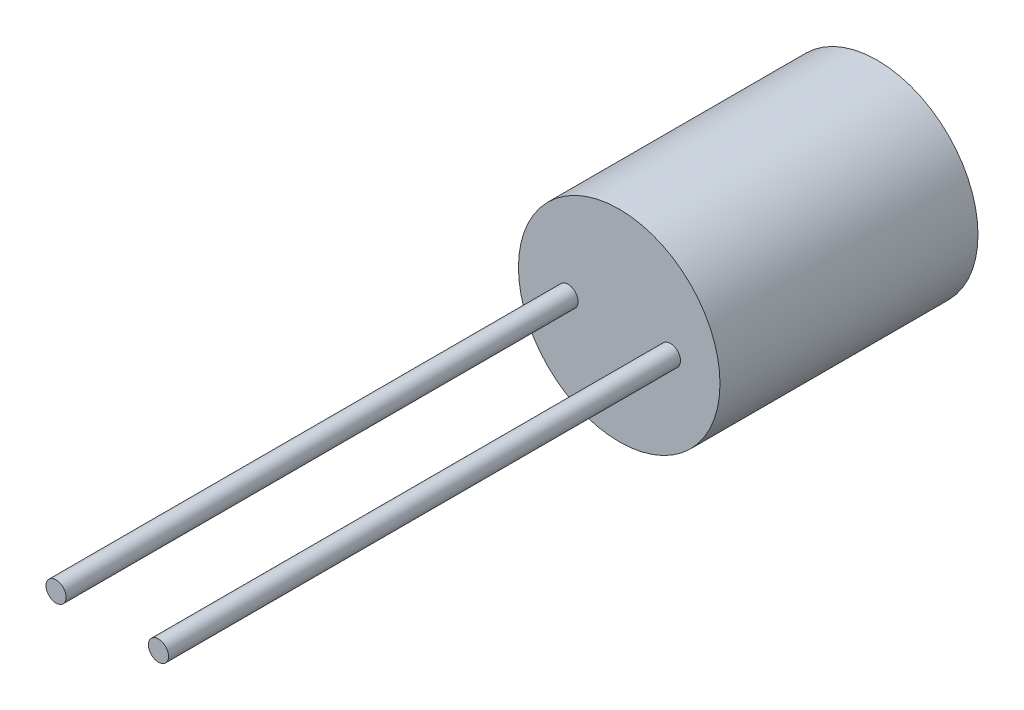
ISO-10303-21;
HEADER;
FILE_DESCRIPTION(('STEP AP214'),'2;1');
FILE_NAME('part.step','',(''),(''),'','','');
FILE_SCHEMA(('AUTOMOTIVE_DESIGN { 1 0 10303 214 1 1 1 1 }'));
ENDSEC;
DATA;
#1=APPLICATION_CONTEXT('core data for automotive mechanical design processes');
#2=APPLICATION_PROTOCOL_DEFINITION('international standard','automotive_design',2000,#1);
#3=PRODUCT_CONTEXT('',#1,'mechanical');
#4=PRODUCT('Part','Part','',(#3));
#5=PRODUCT_RELATED_PRODUCT_CATEGORY('part','',(#4));
#6=PRODUCT_DEFINITION_FORMATION('','',#4);
#7=PRODUCT_DEFINITION_CONTEXT('part definition',#1,'design');
#8=PRODUCT_DEFINITION('design','',#6,#7);
#9=PRODUCT_DEFINITION_SHAPE('','',#8);
#10=(LENGTH_UNIT() NAMED_UNIT(*) SI_UNIT(.MILLI.,.METRE.));
#11=(NAMED_UNIT(*) PLANE_ANGLE_UNIT() SI_UNIT($,.RADIAN.));
#12=(NAMED_UNIT(*) SI_UNIT($,.STERADIAN.) SOLID_ANGLE_UNIT());
#13=UNCERTAINTY_MEASURE_WITH_UNIT(LENGTH_MEASURE(1.E-05),#10,'distance_accuracy_value','');
#14=(GEOMETRIC_REPRESENTATION_CONTEXT(3) GLOBAL_UNCERTAINTY_ASSIGNED_CONTEXT((#13)) GLOBAL_UNIT_ASSIGNED_CONTEXT((#10,
#11,#12)) REPRESENTATION_CONTEXT('',''));
#15=CARTESIAN_POINT('',(0.,0.,0.));
#16=DIRECTION('',(0.,0.,1.));
#17=DIRECTION('',(1.,0.,0.));
#18=AXIS2_PLACEMENT_3D('',#15,#16,#17);
#19=CARTESIAN_POINT('',(0.,0.,6.4));
#20=DIRECTION('',(0.,0.,1.));
#21=DIRECTION('',(1.,0.,0.));
#22=AXIS2_PLACEMENT_3D('',#19,#20,#21);
#23=PLANE('',#22);
#24=CARTESIAN_POINT('',(-1.27,0.,6.4));
#25=DIRECTION('',(0.,0.,1.));
#26=DIRECTION('',(1.,0.,0.));
#27=AXIS2_PLACEMENT_3D('',#24,#25,#26);
#28=CIRCLE('',#27,0.25);
#29=CARTESIAN_POINT('',(-1.02,0.,6.4));
#30=VERTEX_POINT('',#29);
#31=EDGE_CURVE('E48',#30,#30,#28,.T.);
#32=ORIENTED_EDGE('',*,*,#31,.F.);
#33=EDGE_LOOP('',(#32));
#34=FACE_BOUND('',#33,.T.);
#35=CARTESIAN_POINT('',(0.,0.,6.4));
#36=DIRECTION('',(0.,0.,1.));
#37=DIRECTION('',(1.,0.,0.));
#38=AXIS2_PLACEMENT_3D('',#35,#36,#37);
#39=CIRCLE('',#38,2.5);
#40=CARTESIAN_POINT('',(-2.5,0.,6.4));
#41=VERTEX_POINT('',#40);
#42=EDGE_CURVE('E40',#41,#41,#39,.T.);
#43=ORIENTED_EDGE('',*,*,#42,.T.);
#44=EDGE_LOOP('',(#43));
#45=FACE_BOUND('',#44,.T.);
#46=CARTESIAN_POINT('',(1.27,0.,6.4));
#47=DIRECTION('',(0.,0.,1.));
#48=DIRECTION('',(-1.,0.,0.));
#49=AXIS2_PLACEMENT_3D('',#46,#47,#48);
#50=CIRCLE('',#49,0.25);
#51=CARTESIAN_POINT('',(1.02,0.,6.4));
#52=VERTEX_POINT('',#51);
#53=EDGE_CURVE('E54',#52,#52,#50,.T.);
#54=ORIENTED_EDGE('',*,*,#53,.F.);
#55=EDGE_LOOP('',(#54));
#56=FACE_BOUND('',#55,.T.);
#57=ADVANCED_FACE('F33',(#34,#45,#56),#23,.T.);
#58=CARTESIAN_POINT('',(0.,0.,5.4));
#59=DIRECTION('',(0.,0.,-1.));
#60=DIRECTION('',(-1.,0.,0.));
#61=AXIS2_PLACEMENT_3D('',#58,#59,#60);
#62=CYLINDRICAL_SURFACE('',#61,2.5);
#63=CARTESIAN_POINT('',(0.,0.,0.));
#64=DIRECTION('',(0.,0.,1.));
#65=DIRECTION('',(1.,0.,0.));
#66=AXIS2_PLACEMENT_3D('',#63,#64,#65);
#67=CIRCLE('',#66,2.5);
#68=CARTESIAN_POINT('',(-2.5,0.,0.));
#69=VERTEX_POINT('',#68);
#70=EDGE_CURVE('E10',#69,#69,#67,.T.);
#71=CARTESIAN_POINT('',(-2.5,0.,0.));
#72=CARTESIAN_POINT('',(-2.5,0.,0.0666666666666657));
#73=CARTESIAN_POINT('',(-2.5,0.,0.133333333333332));
#74=CARTESIAN_POINT('',(-2.5,0.,0.266666666666666));
#75=CARTESIAN_POINT('',(-2.5,0.,0.333333333333332));
#76=CARTESIAN_POINT('',(-2.5,0.,0.466666666666666));
#77=CARTESIAN_POINT('',(-2.5,0.,0.533333333333332));
#78=CARTESIAN_POINT('',(-2.5,0.,0.666666666666666));
#79=CARTESIAN_POINT('',(-2.5,0.,0.733333333333333));
#80=CARTESIAN_POINT('',(-2.5,0.,0.866666666666666));
#81=CARTESIAN_POINT('',(-2.5,0.,0.933333333333333));
#82=CARTESIAN_POINT('',(-2.5,0.,1.06666666666667));
#83=CARTESIAN_POINT('',(-2.5,0.,1.13333333333333));
#84=CARTESIAN_POINT('',(-2.5,0.,1.26666666666667));
#85=CARTESIAN_POINT('',(-2.5,0.,1.33333333333333));
#86=CARTESIAN_POINT('',(-2.5,0.,1.46666666666667));
#87=CARTESIAN_POINT('',(-2.5,0.,1.53333333333333));
#88=CARTESIAN_POINT('',(-2.5,0.,1.66666666666667));
#89=CARTESIAN_POINT('',(-2.5,0.,1.73333333333333));
#90=CARTESIAN_POINT('',(-2.5,0.,1.86666666666667));
#91=CARTESIAN_POINT('',(-2.5,0.,1.93333333333333));
#92=CARTESIAN_POINT('',(-2.5,0.,2.06666666666667));
#93=CARTESIAN_POINT('',(-2.5,0.,2.13333333333333));
#94=CARTESIAN_POINT('',(-2.5,0.,2.26666666666667));
#95=CARTESIAN_POINT('',(-2.5,0.,2.33333333333333));
#96=CARTESIAN_POINT('',(-2.5,0.,2.46666666666667));
#97=CARTESIAN_POINT('',(-2.5,0.,2.53333333333333));
#98=CARTESIAN_POINT('',(-2.5,0.,2.66666666666667));
#99=CARTESIAN_POINT('',(-2.5,0.,2.73333333333333));
#100=CARTESIAN_POINT('',(-2.5,0.,2.86666666666667));
#101=CARTESIAN_POINT('',(-2.5,0.,2.93333333333333));
#102=CARTESIAN_POINT('',(-2.5,0.,3.06666666666667));
#103=CARTESIAN_POINT('',(-2.5,0.,3.13333333333333));
#104=CARTESIAN_POINT('',(-2.5,0.,3.26666666666667));
#105=CARTESIAN_POINT('',(-2.5,0.,3.33333333333333));
#106=CARTESIAN_POINT('',(-2.5,0.,3.46666666666667));
#107=CARTESIAN_POINT('',(-2.5,0.,3.53333333333333));
#108=CARTESIAN_POINT('',(-2.5,0.,3.66666666666667));
#109=CARTESIAN_POINT('',(-2.5,0.,3.73333333333333));
#110=CARTESIAN_POINT('',(-2.5,0.,3.86666666666667));
#111=CARTESIAN_POINT('',(-2.5,0.,3.93333333333333));
#112=CARTESIAN_POINT('',(-2.5,0.,4.06666666666667));
#113=CARTESIAN_POINT('',(-2.5,0.,4.13333333333333));
#114=CARTESIAN_POINT('',(-2.5,0.,4.26666666666667));
#115=CARTESIAN_POINT('',(-2.5,0.,4.33333333333333));
#116=CARTESIAN_POINT('',(-2.5,0.,4.46666666666667));
#117=CARTESIAN_POINT('',(-2.5,0.,4.53333333333333));
#118=CARTESIAN_POINT('',(-2.5,0.,4.66666666666667));
#119=CARTESIAN_POINT('',(-2.5,0.,4.73333333333333));
#120=CARTESIAN_POINT('',(-2.5,0.,4.86666666666667));
#121=CARTESIAN_POINT('',(-2.5,0.,4.93333333333333));
#122=CARTESIAN_POINT('',(-2.5,0.,5.06666666666667));
#123=CARTESIAN_POINT('',(-2.5,0.,5.13333333333333));
#124=CARTESIAN_POINT('',(-2.5,0.,5.26666666666667));
#125=CARTESIAN_POINT('',(-2.5,0.,5.33333333333333));
#126=CARTESIAN_POINT('',(-2.5,0.,5.46666666666667));
#127=CARTESIAN_POINT('',(-2.5,0.,5.53333333333333));
#128=CARTESIAN_POINT('',(-2.5,0.,5.66666666666667));
#129=CARTESIAN_POINT('',(-2.5,0.,5.73333333333333));
#130=CARTESIAN_POINT('',(-2.5,0.,5.86666666666667));
#131=CARTESIAN_POINT('',(-2.5,0.,5.93333333333333));
#132=CARTESIAN_POINT('',(-2.5,0.,6.06666666666667));
#133=CARTESIAN_POINT('',(-2.5,0.,6.13333333333333));
#134=CARTESIAN_POINT('',(-2.5,0.,6.26666666666667));
#135=CARTESIAN_POINT('',(-2.5,0.,6.33333333333333));
#136=CARTESIAN_POINT('',(-2.5,0.,6.4));
#137=B_SPLINE_CURVE_WITH_KNOTS('',3,(#71,#72,#73,#74,#75,#76,#77,#78,#79,#80,#81,#82,#83,#84,
#85,#86,#87,#88,#89,#90,#91,#92,#93,#94,#95,#96,#97,#98,#99,#100,#101,#102,#103,#104,#105,#106,
#107,#108,#109,#110,#111,#112,#113,#114,#115,#116,#117,#118,#119,#120,#121,#122,#123,#124,#125,
#126,#127,#128,#129,#130,#131,#132,#133,#134,#135,#136),.UNSPECIFIED.,.F.,.F.,(4,2,2,2,2,2,2,2,
2,2,2,2,2,2,2,2,2,2,2,2,2,2,2,2,2,2,2,2,2,2,2,2,4),(0.,0.2,0.4,0.6,0.8,1.,1.2,1.4,1.6,1.8,2.,
2.2,2.4,2.6,2.8,3.,3.2,3.4,3.6,3.8,4.,4.2,4.4,4.6,4.8,5.,5.2,5.4,5.6,5.8,6.,6.2,6.4),.UNSPECIFIED.);
#138=EDGE_CURVE('BSEAM35',#69,#41,#137,.T.);
#139=ORIENTED_EDGE('',*,*,#70,.T.);
#140=ORIENTED_EDGE('',*,*,#42,.F.);
#141=ORIENTED_EDGE('',*,*,#138,.T.);
#142=ORIENTED_EDGE('',*,*,#138,.F.);
#143=EDGE_LOOP('',(#139,#141,#140,#142));
#144=FACE_BOUND('',#143,.T.);
#145=ADVANCED_FACE('F35',(#144),#62,.T.);
#146=CARTESIAN_POINT('',(0.,0.,0.));
#147=DIRECTION('',(0.,0.,1.));
#148=DIRECTION('',(1.,0.,0.));
#149=AXIS2_PLACEMENT_3D('',#146,#147,#148);
#150=PLANE('',#149);
#151=ORIENTED_EDGE('',*,*,#70,.F.);
#152=EDGE_LOOP('',(#151));
#153=FACE_BOUND('',#152,.T.);
#154=ADVANCED_FACE('F75',(#153),#150,.F.);
#155=CARTESIAN_POINT('',(-1.27,0.,19.1));
#156=DIRECTION('',(0.,0.,-1.));
#157=DIRECTION('',(-1.,0.,0.));
#158=AXIS2_PLACEMENT_3D('',#155,#156,#157);
#159=CYLINDRICAL_SURFACE('',#158,0.25);
#160=CARTESIAN_POINT('',(-1.27,0.,19.1));
#161=DIRECTION('',(0.,0.,1.));
#162=DIRECTION('',(1.,0.,0.));
#163=AXIS2_PLACEMENT_3D('',#160,#161,#162);
#164=CIRCLE('',#163,0.25);
#165=CARTESIAN_POINT('',(-1.02,0.,19.1));
#166=VERTEX_POINT('',#165);
#167=EDGE_CURVE('E44',#166,#166,#164,.T.);
#168=ORIENTED_EDGE('',*,*,#167,.F.);
#169=EDGE_LOOP('',(#168));
#170=FACE_BOUND('',#169,.T.);
#171=ORIENTED_EDGE('',*,*,#31,.T.);
#172=EDGE_LOOP('',(#171));
#173=FACE_BOUND('',#172,.T.);
#174=ADVANCED_FACE('F78',(#170,#173),#159,.T.);
#175=CARTESIAN_POINT('',(-1.27,0.,19.1));
#176=DIRECTION('',(0.,0.,1.));
#177=DIRECTION('',(1.,0.,0.));
#178=AXIS2_PLACEMENT_3D('',#175,#176,#177);
#179=PLANE('',#178);
#180=ORIENTED_EDGE('',*,*,#167,.T.);
#181=EDGE_LOOP('',(#180));
#182=FACE_BOUND('',#181,.T.);
#183=ADVANCED_FACE('F65',(#182),#179,.T.);
#184=CARTESIAN_POINT('',(1.27,0.,19.1));
#185=DIRECTION('',(0.,0.,-1.));
#186=DIRECTION('',(-1.,0.,0.));
#187=AXIS2_PLACEMENT_3D('',#184,#185,#186);
#188=CYLINDRICAL_SURFACE('',#187,0.25);
#189=CARTESIAN_POINT('',(1.27,0.,19.1));
#190=DIRECTION('',(0.,0.,1.));
#191=DIRECTION('',(-1.,0.,0.));
#192=AXIS2_PLACEMENT_3D('',#189,#190,#191);
#193=CIRCLE('',#192,0.25);
#194=CARTESIAN_POINT('',(1.02,0.,19.1));
#195=VERTEX_POINT('',#194);
#196=EDGE_CURVE('E52',#195,#195,#193,.T.);
#197=ORIENTED_EDGE('',*,*,#196,.F.);
#198=EDGE_LOOP('',(#197));
#199=FACE_BOUND('',#198,.T.);
#200=ORIENTED_EDGE('',*,*,#53,.T.);
#201=EDGE_LOOP('',(#200));
#202=FACE_BOUND('',#201,.T.);
#203=ADVANCED_FACE('F62',(#199,#202),#188,.T.);
#204=CARTESIAN_POINT('',(1.27,0.,19.1));
#205=DIRECTION('',(0.,0.,-1.));
#206=DIRECTION('',(-1.,0.,0.));
#207=AXIS2_PLACEMENT_3D('',#204,#205,#206);
#208=PLANE('',#207);
#209=ORIENTED_EDGE('',*,*,#196,.T.);
#210=EDGE_LOOP('',(#209));
#211=FACE_BOUND('',#210,.T.);
#212=ADVANCED_FACE('F60',(#211),#208,.F.);
#213=CLOSED_SHELL('',(#57,#145,#154,#174,#183,#203,#212));
#214=MANIFOLD_SOLID_BREP('B2',#213);
#215=ADVANCED_BREP_SHAPE_REPRESENTATION('',(#18,#214),#14);
#216=SHAPE_DEFINITION_REPRESENTATION(#9,#215);
ENDSEC;
END-ISO-10303-21;
